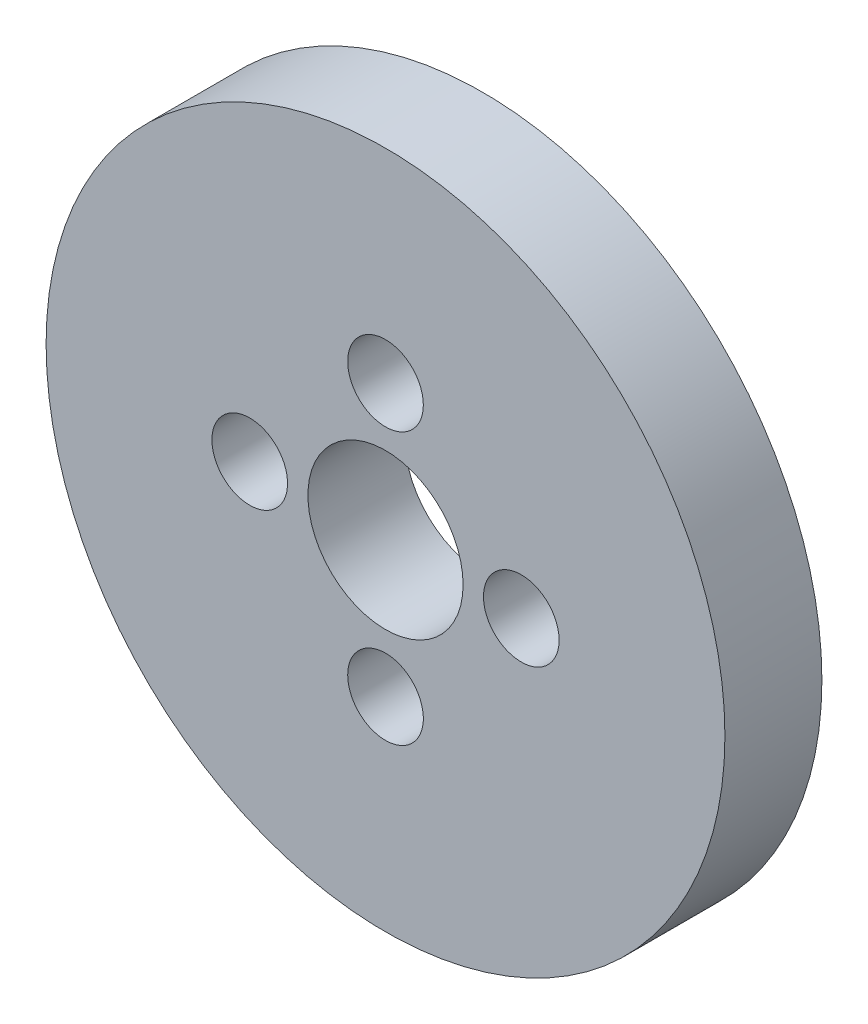
ISO-10303-21;
HEADER;
FILE_DESCRIPTION(('STEP AP214'),'2;1');
FILE_NAME('part.step','',(''),(''),'','','');
FILE_SCHEMA(('AUTOMOTIVE_DESIGN { 1 0 10303 214 1 1 1 1 }'));
ENDSEC;
DATA;
#1=APPLICATION_CONTEXT('core data for automotive mechanical design processes');
#2=APPLICATION_PROTOCOL_DEFINITION('international standard','automotive_design',2000,#1);
#3=PRODUCT_CONTEXT('',#1,'mechanical');
#4=PRODUCT('Part','Part','',(#3));
#5=PRODUCT_RELATED_PRODUCT_CATEGORY('part','',(#4));
#6=PRODUCT_DEFINITION_FORMATION('','',#4);
#7=PRODUCT_DEFINITION_CONTEXT('part definition',#1,'design');
#8=PRODUCT_DEFINITION('design','',#6,#7);
#9=PRODUCT_DEFINITION_SHAPE('','',#8);
#10=(LENGTH_UNIT() NAMED_UNIT(*) SI_UNIT(.MILLI.,.METRE.));
#11=(NAMED_UNIT(*) PLANE_ANGLE_UNIT() SI_UNIT($,.RADIAN.));
#12=(NAMED_UNIT(*) SI_UNIT($,.STERADIAN.) SOLID_ANGLE_UNIT());
#13=UNCERTAINTY_MEASURE_WITH_UNIT(LENGTH_MEASURE(1.E-05),#10,'distance_accuracy_value','');
#14=(GEOMETRIC_REPRESENTATION_CONTEXT(3) GLOBAL_UNCERTAINTY_ASSIGNED_CONTEXT((#13)) GLOBAL_UNIT_ASSIGNED_CONTEXT((#10,
#11,#12)) REPRESENTATION_CONTEXT('',''));
#15=CARTESIAN_POINT('',(0.,0.,0.));
#16=DIRECTION('',(0.,0.,1.));
#17=DIRECTION('',(1.,0.,0.));
#18=AXIS2_PLACEMENT_3D('',#15,#16,#17);
#19=CARTESIAN_POINT('',(0.,0.,5.));
#20=DIRECTION('',(0.,0.,1.));
#21=DIRECTION('',(1.,0.,0.));
#22=AXIS2_PLACEMENT_3D('',#19,#20,#21);
#23=PLANE('',#22);
#24=CARTESIAN_POINT('',(0.,-7.,5.));
#25=DIRECTION('',(0.,0.,1.));
#26=DIRECTION('',(-1.,0.,0.));
#27=AXIS2_PLACEMENT_3D('',#24,#25,#26);
#28=CIRCLE('',#27,1.95);
#29=CARTESIAN_POINT('',(-1.95,-7.,5.));
#30=VERTEX_POINT('',#29);
#31=EDGE_CURVE('E59',#30,#30,#28,.T.);
#32=ORIENTED_EDGE('',*,*,#31,.F.);
#33=EDGE_LOOP('',(#32));
#34=FACE_BOUND('',#33,.T.);
#35=CARTESIAN_POINT('',(7.,0.,5.));
#36=DIRECTION('',(0.,0.,1.));
#37=DIRECTION('',(1.,0.,0.));
#38=AXIS2_PLACEMENT_3D('',#35,#36,#37);
#39=CIRCLE('',#38,1.95);
#40=CARTESIAN_POINT('',(8.95,0.,5.));
#41=VERTEX_POINT('',#40);
#42=EDGE_CURVE('E47',#41,#41,#39,.T.);
#43=ORIENTED_EDGE('',*,*,#42,.F.);
#44=EDGE_LOOP('',(#43));
#45=FACE_BOUND('',#44,.T.);
#46=CARTESIAN_POINT('',(0.,0.,5.));
#47=DIRECTION('',(0.,0.,1.));
#48=DIRECTION('',(1.,0.,0.));
#49=AXIS2_PLACEMENT_3D('',#46,#47,#48);
#50=CIRCLE('',#49,17.5);
#51=CARTESIAN_POINT('',(17.5,0.,5.));
#52=VERTEX_POINT('',#51);
#53=EDGE_CURVE('E10',#52,#52,#50,.T.);
#54=ORIENTED_EDGE('',*,*,#53,.T.);
#55=EDGE_LOOP('',(#54));
#56=FACE_BOUND('',#55,.T.);
#57=CARTESIAN_POINT('',(0.,0.,5.));
#58=DIRECTION('',(0.,0.,1.));
#59=DIRECTION('',(1.,0.,0.));
#60=AXIS2_PLACEMENT_3D('',#57,#58,#59);
#61=CIRCLE('',#60,4.);
#62=CARTESIAN_POINT('',(4.,0.,5.));
#63=VERTEX_POINT('',#62);
#64=EDGE_CURVE('E42',#63,#63,#61,.T.);
#65=ORIENTED_EDGE('',*,*,#64,.F.);
#66=EDGE_LOOP('',(#65));
#67=FACE_BOUND('',#66,.T.);
#68=CARTESIAN_POINT('',(0.,7.,5.));
#69=DIRECTION('',(0.,0.,1.));
#70=DIRECTION('',(1.,0.,0.));
#71=AXIS2_PLACEMENT_3D('',#68,#69,#70);
#72=CIRCLE('',#71,1.95);
#73=CARTESIAN_POINT('',(1.95,7.,5.));
#74=VERTEX_POINT('',#73);
#75=EDGE_CURVE('E53',#74,#74,#72,.T.);
#76=ORIENTED_EDGE('',*,*,#75,.F.);
#77=EDGE_LOOP('',(#76));
#78=FACE_BOUND('',#77,.T.);
#79=CARTESIAN_POINT('',(-7.,0.,5.));
#80=DIRECTION('',(0.,0.,1.));
#81=DIRECTION('',(-1.,0.,0.));
#82=AXIS2_PLACEMENT_3D('',#79,#80,#81);
#83=CIRCLE('',#82,1.95);
#84=CARTESIAN_POINT('',(-8.95,0.,5.));
#85=VERTEX_POINT('',#84);
#86=EDGE_CURVE('E65',#85,#85,#83,.T.);
#87=ORIENTED_EDGE('',*,*,#86,.F.);
#88=EDGE_LOOP('',(#87));
#89=FACE_BOUND('',#88,.T.);
#90=ADVANCED_FACE('F31',(#34,#45,#56,#67,#78,#89),#23,.T.);
#91=CARTESIAN_POINT('',(0.,0.,0.));
#92=DIRECTION('',(0.,0.,1.));
#93=DIRECTION('',(1.,0.,0.));
#94=AXIS2_PLACEMENT_3D('',#91,#92,#93);
#95=PLANE('',#94);
#96=CARTESIAN_POINT('',(0.,0.,0.));
#97=DIRECTION('',(0.,0.,1.));
#98=DIRECTION('',(1.,0.,0.));
#99=AXIS2_PLACEMENT_3D('',#96,#97,#98);
#100=CIRCLE('',#99,17.5);
#101=CARTESIAN_POINT('',(17.5,0.,0.));
#102=VERTEX_POINT('',#101);
#103=EDGE_CURVE('E35',#102,#102,#100,.T.);
#104=ORIENTED_EDGE('',*,*,#103,.F.);
#105=EDGE_LOOP('',(#104));
#106=FACE_BOUND('',#105,.T.);
#107=CARTESIAN_POINT('',(0.,0.,0.));
#108=DIRECTION('',(0.,0.,1.));
#109=DIRECTION('',(1.,0.,0.));
#110=AXIS2_PLACEMENT_3D('',#107,#108,#109);
#111=CIRCLE('',#110,4.);
#112=CARTESIAN_POINT('',(4.,0.,0.));
#113=VERTEX_POINT('',#112);
#114=EDGE_CURVE('E44',#113,#113,#111,.T.);
#115=ORIENTED_EDGE('',*,*,#114,.T.);
#116=EDGE_LOOP('',(#115));
#117=FACE_BOUND('',#116,.T.);
#118=CARTESIAN_POINT('',(7.,0.,0.));
#119=DIRECTION('',(0.,0.,1.));
#120=DIRECTION('',(1.,0.,0.));
#121=AXIS2_PLACEMENT_3D('',#118,#119,#120);
#122=CIRCLE('',#121,1.95);
#123=CARTESIAN_POINT('',(8.95,0.,0.));
#124=VERTEX_POINT('',#123);
#125=EDGE_CURVE('E50',#124,#124,#122,.T.);
#126=ORIENTED_EDGE('',*,*,#125,.T.);
#127=EDGE_LOOP('',(#126));
#128=FACE_BOUND('',#127,.T.);
#129=CARTESIAN_POINT('',(0.,7.,0.));
#130=DIRECTION('',(0.,0.,1.));
#131=DIRECTION('',(1.,0.,0.));
#132=AXIS2_PLACEMENT_3D('',#129,#130,#131);
#133=CIRCLE('',#132,1.95);
#134=CARTESIAN_POINT('',(1.95,7.,0.));
#135=VERTEX_POINT('',#134);
#136=EDGE_CURVE('E56',#135,#135,#133,.T.);
#137=ORIENTED_EDGE('',*,*,#136,.T.);
#138=EDGE_LOOP('',(#137));
#139=FACE_BOUND('',#138,.T.);
#140=CARTESIAN_POINT('',(0.,-7.,0.));
#141=DIRECTION('',(0.,0.,1.));
#142=DIRECTION('',(-1.,0.,0.));
#143=AXIS2_PLACEMENT_3D('',#140,#141,#142);
#144=CIRCLE('',#143,1.95);
#145=CARTESIAN_POINT('',(-1.95,-7.,0.));
#146=VERTEX_POINT('',#145);
#147=EDGE_CURVE('E62',#146,#146,#144,.T.);
#148=ORIENTED_EDGE('',*,*,#147,.T.);
#149=EDGE_LOOP('',(#148));
#150=FACE_BOUND('',#149,.T.);
#151=CARTESIAN_POINT('',(-7.,0.,0.));
#152=DIRECTION('',(0.,0.,1.));
#153=DIRECTION('',(-1.,0.,0.));
#154=AXIS2_PLACEMENT_3D('',#151,#152,#153);
#155=CIRCLE('',#154,1.95);
#156=CARTESIAN_POINT('',(-8.95,0.,0.));
#157=VERTEX_POINT('',#156);
#158=EDGE_CURVE('E68',#157,#157,#155,.T.);
#159=ORIENTED_EDGE('',*,*,#158,.T.);
#160=EDGE_LOOP('',(#159));
#161=FACE_BOUND('',#160,.T.);
#162=ADVANCED_FACE('F78',(#106,#117,#128,#139,#150,#161),#95,.F.);
#163=CARTESIAN_POINT('',(0.,0.,5.));
#164=DIRECTION('',(0.,0.,-1.));
#165=DIRECTION('',(-1.,0.,0.));
#166=AXIS2_PLACEMENT_3D('',#163,#164,#165);
#167=CYLINDRICAL_SURFACE('',#166,17.5);
#168=ORIENTED_EDGE('',*,*,#53,.F.);
#169=EDGE_LOOP('',(#168));
#170=FACE_BOUND('',#169,.T.);
#171=ORIENTED_EDGE('',*,*,#103,.T.);
#172=EDGE_LOOP('',(#171));
#173=FACE_BOUND('',#172,.T.);
#174=ADVANCED_FACE('F33',(#170,#173),#167,.T.);
#175=CARTESIAN_POINT('',(0.,0.,5.));
#176=DIRECTION('',(0.,0.,-1.));
#177=DIRECTION('',(-1.,0.,0.));
#178=AXIS2_PLACEMENT_3D('',#175,#176,#177);
#179=CYLINDRICAL_SURFACE('',#178,4.);
#180=ORIENTED_EDGE('',*,*,#64,.T.);
#181=EDGE_LOOP('',(#180));
#182=FACE_BOUND('',#181,.T.);
#183=ORIENTED_EDGE('',*,*,#114,.F.);
#184=EDGE_LOOP('',(#183));
#185=FACE_BOUND('',#184,.T.);
#186=ADVANCED_FACE('F88',(#182,#185),#179,.F.);
#187=CARTESIAN_POINT('',(7.,0.,5.));
#188=DIRECTION('',(0.,0.,-1.));
#189=DIRECTION('',(-1.,0.,0.));
#190=AXIS2_PLACEMENT_3D('',#187,#188,#189);
#191=CYLINDRICAL_SURFACE('',#190,1.95);
#192=ORIENTED_EDGE('',*,*,#42,.T.);
#193=EDGE_LOOP('',(#192));
#194=FACE_BOUND('',#193,.T.);
#195=ORIENTED_EDGE('',*,*,#125,.F.);
#196=EDGE_LOOP('',(#195));
#197=FACE_BOUND('',#196,.T.);
#198=ADVANCED_FACE('F91',(#194,#197),#191,.F.);
#199=CARTESIAN_POINT('',(0.,7.,5.));
#200=DIRECTION('',(0.,0.,-1.));
#201=DIRECTION('',(-1.,0.,0.));
#202=AXIS2_PLACEMENT_3D('',#199,#200,#201);
#203=CYLINDRICAL_SURFACE('',#202,1.95);
#204=ORIENTED_EDGE('',*,*,#75,.T.);
#205=EDGE_LOOP('',(#204));
#206=FACE_BOUND('',#205,.T.);
#207=ORIENTED_EDGE('',*,*,#136,.F.);
#208=EDGE_LOOP('',(#207));
#209=FACE_BOUND('',#208,.T.);
#210=ADVANCED_FACE('F95',(#206,#209),#203,.F.);
#211=CARTESIAN_POINT('',(0.,-7.,5.));
#212=DIRECTION('',(0.,0.,-1.));
#213=DIRECTION('',(-1.,0.,0.));
#214=AXIS2_PLACEMENT_3D('',#211,#212,#213);
#215=CYLINDRICAL_SURFACE('',#214,1.95);
#216=ORIENTED_EDGE('',*,*,#31,.T.);
#217=EDGE_LOOP('',(#216));
#218=FACE_BOUND('',#217,.T.);
#219=ORIENTED_EDGE('',*,*,#147,.F.);
#220=EDGE_LOOP('',(#219));
#221=FACE_BOUND('',#220,.T.);
#222=ADVANCED_FACE('F99',(#218,#221),#215,.F.);
#223=CARTESIAN_POINT('',(-7.,0.,5.));
#224=DIRECTION('',(0.,0.,-1.));
#225=DIRECTION('',(-1.,0.,0.));
#226=AXIS2_PLACEMENT_3D('',#223,#224,#225);
#227=CYLINDRICAL_SURFACE('',#226,1.95);
#228=ORIENTED_EDGE('',*,*,#86,.T.);
#229=EDGE_LOOP('',(#228));
#230=FACE_BOUND('',#229,.T.);
#231=ORIENTED_EDGE('',*,*,#158,.F.);
#232=EDGE_LOOP('',(#231));
#233=FACE_BOUND('',#232,.T.);
#234=ADVANCED_FACE('F74',(#230,#233),#227,.F.);
#235=CLOSED_SHELL('',(#90,#162,#174,#186,#198,#210,#222,#234));
#236=MANIFOLD_SOLID_BREP('B2',#235);
#237=ADVANCED_BREP_SHAPE_REPRESENTATION('',(#18,#236),#14);
#238=SHAPE_DEFINITION_REPRESENTATION(#9,#237);
ENDSEC;
END-ISO-10303-21;
